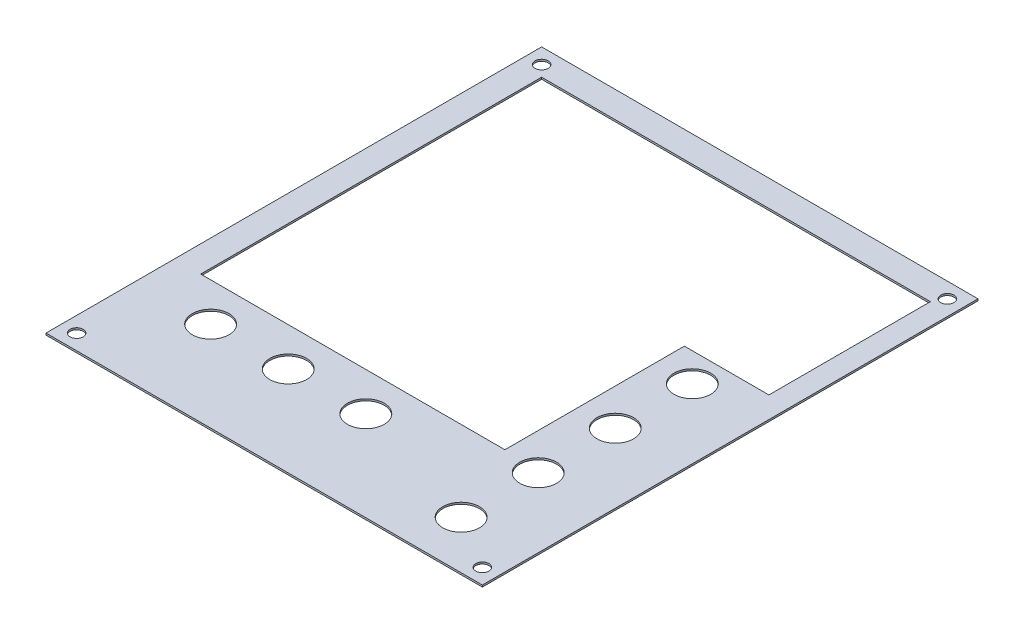
ISO-10303-21;
HEADER;
FILE_DESCRIPTION(('STEP AP214'),'2;1');
FILE_NAME('part.step','',(''),(''),'','','');
FILE_SCHEMA(('AUTOMOTIVE_DESIGN { 1 0 10303 214 1 1 1 1 }'));
ENDSEC;
DATA;
#1=APPLICATION_CONTEXT('core data for automotive mechanical design processes');
#2=APPLICATION_PROTOCOL_DEFINITION('international standard','automotive_design',2000,#1);
#3=PRODUCT_CONTEXT('',#1,'mechanical');
#4=PRODUCT('Part','Part','',(#3));
#5=PRODUCT_RELATED_PRODUCT_CATEGORY('part','',(#4));
#6=PRODUCT_DEFINITION_FORMATION('','',#4);
#7=PRODUCT_DEFINITION_CONTEXT('part definition',#1,'design');
#8=PRODUCT_DEFINITION('design','',#6,#7);
#9=PRODUCT_DEFINITION_SHAPE('','',#8);
#10=(LENGTH_UNIT() NAMED_UNIT(*) SI_UNIT(.MILLI.,.METRE.));
#11=(NAMED_UNIT(*) PLANE_ANGLE_UNIT() SI_UNIT($,.RADIAN.));
#12=(NAMED_UNIT(*) SI_UNIT($,.STERADIAN.) SOLID_ANGLE_UNIT());
#13=UNCERTAINTY_MEASURE_WITH_UNIT(LENGTH_MEASURE(1.E-05),#10,'distance_accuracy_value','');
#14=(GEOMETRIC_REPRESENTATION_CONTEXT(3) GLOBAL_UNCERTAINTY_ASSIGNED_CONTEXT((#13)) GLOBAL_UNIT_ASSIGNED_CONTEXT((#10,
#11,#12)) REPRESENTATION_CONTEXT('',''));
#15=CARTESIAN_POINT('',(0.,0.,0.));
#16=DIRECTION('',(0.,0.,1.));
#17=DIRECTION('',(1.,0.,0.));
#18=AXIS2_PLACEMENT_3D('',#15,#16,#17);
#19=CARTESIAN_POINT('',(0.,0.35,0.));
#20=DIRECTION('',(0.,1.,0.));
#21=DIRECTION('',(0.,0.,1.));
#22=AXIS2_PLACEMENT_3D('',#19,#20,#21);
#23=PLANE('',#22);
#24=CARTESIAN_POINT('',(67.047,0.35,-35.628));
#25=DIRECTION('',(0.,1.,0.));
#26=DIRECTION('',(0.,0.,1.));
#27=AXIS2_PLACEMENT_3D('',#24,#25,#26);
#28=CIRCLE('',#27,3.50000000000001);
#29=CARTESIAN_POINT('',(67.047,0.35,-32.128));
#30=VERTEX_POINT('',#29);
#31=EDGE_CURVE('E200',#30,#30,#28,.T.);
#32=ORIENTED_EDGE('',*,*,#31,.F.);
#33=EDGE_LOOP('',(#32));
#34=FACE_BOUND('',#33,.T.);
#35=CARTESIAN_POINT('',(67.047,0.35,-6.248));
#36=DIRECTION('',(0.,1.,0.));
#37=DIRECTION('',(0.,0.,1.));
#38=AXIS2_PLACEMENT_3D('',#35,#36,#37);
#39=CIRCLE('',#38,3.50000000000001);
#40=CARTESIAN_POINT('',(67.047,0.35,-2.74799999999999));
#41=VERTEX_POINT('',#40);
#42=EDGE_CURVE('E216',#41,#41,#39,.T.);
#43=ORIENTED_EDGE('',*,*,#42,.F.);
#44=EDGE_LOOP('',(#43));
#45=FACE_BOUND('',#44,.T.);
#46=CARTESIAN_POINT('',(26.095,0.35,-14.24));
#47=DIRECTION('',(0.,1.,0.));
#48=DIRECTION('',(0.,0.,1.));
#49=AXIS2_PLACEMENT_3D('',#46,#47,#48);
#50=CIRCLE('',#49,3.5);
#51=CARTESIAN_POINT('',(26.095,0.35,-10.74));
#52=VERTEX_POINT('',#51);
#53=EDGE_CURVE('E232',#52,#52,#50,.T.);
#54=ORIENTED_EDGE('',*,*,#53,.F.);
#55=EDGE_LOOP('',(#54));
#56=FACE_BOUND('',#55,.T.);
#57=CARTESIAN_POINT('',(0.,0.35,0.));
#58=DIRECTION('',(0.,1.,0.));
#59=DIRECTION('',(0.,0.,1.));
#60=AXIS2_PLACEMENT_3D('',#57,#58,#59);
#61=CIRCLE('',#60,1.25);
#62=CARTESIAN_POINT('',(0.,0.35,1.25));
#63=VERTEX_POINT('',#62);
#64=EDGE_CURVE('E248',#63,#63,#61,.T.);
#65=ORIENTED_EDGE('',*,*,#64,.F.);
#66=EDGE_LOOP('',(#65));
#67=FACE_BOUND('',#66,.T.);
#68=CARTESIAN_POINT('',(77.34,0.35,-88.64));
#69=DIRECTION('',(0.,1.,0.));
#70=DIRECTION('',(0.,0.,1.));
#71=AXIS2_PLACEMENT_3D('',#68,#69,#70);
#72=CIRCLE('',#71,1.25);
#73=CARTESIAN_POINT('',(77.34,0.35,-87.39));
#74=VERTEX_POINT('',#73);
#75=EDGE_CURVE('E264',#74,#74,#72,.T.);
#76=ORIENTED_EDGE('',*,*,#75,.F.);
#77=EDGE_LOOP('',(#76));
#78=FACE_BOUND('',#77,.T.);
#79=DIRECTION('',(0.,0.,1.));
#80=VECTOR('',#79,1.);
#81=CARTESIAN_POINT('',(-2.92000000000001,0.35,-91.56));
#82=LINE('',#81,#80);
#83=CARTESIAN_POINT('',(-2.92000000000001,0.35,-91.56));
#84=VERTEX_POINT('',#83);
#85=CARTESIAN_POINT('',(-2.92,0.35,2.92));
#86=VERTEX_POINT('',#85);
#87=EDGE_CURVE('E280',#84,#86,#82,.T.);
#88=ORIENTED_EDGE('',*,*,#87,.T.);
#89=DIRECTION('',(1.,0.,0.));
#90=VECTOR('',#89,1.);
#91=CARTESIAN_POINT('',(-2.92,0.35,2.92));
#92=LINE('',#91,#90);
#93=CARTESIAN_POINT('',(80.26,0.35,2.92));
#94=VERTEX_POINT('',#93);
#95=EDGE_CURVE('E284',#86,#94,#92,.T.);
#96=ORIENTED_EDGE('',*,*,#95,.T.);
#97=DIRECTION('',(0.,0.,-1.));
#98=VECTOR('',#97,1.);
#99=CARTESIAN_POINT('',(80.26,0.35,-91.56));
#100=LINE('',#99,#98);
#101=CARTESIAN_POINT('',(80.26,0.35,-91.56));
#102=VERTEX_POINT('',#101);
#103=EDGE_CURVE('E288',#94,#102,#100,.T.);
#104=ORIENTED_EDGE('',*,*,#103,.T.);
#105=DIRECTION('',(-1.,0.,0.));
#106=VECTOR('',#105,1.);
#107=CARTESIAN_POINT('',(-2.92000000000001,0.35,-91.56));
#108=LINE('',#107,#106);
#109=EDGE_CURVE('E291',#102,#84,#108,.T.);
#110=ORIENTED_EDGE('',*,*,#109,.T.);
#111=EDGE_LOOP('',(#88,#96,#104,#110));
#112=FACE_BOUND('',#111,.T.);
#113=CARTESIAN_POINT('',(0.,0.35,-88.64));
#114=DIRECTION('',(0.,1.,0.));
#115=DIRECTION('',(0.,0.,1.));
#116=AXIS2_PLACEMENT_3D('',#113,#114,#115);
#117=CIRCLE('',#116,1.25);
#118=CARTESIAN_POINT('',(0.,0.35,-87.39));
#119=VERTEX_POINT('',#118);
#120=EDGE_CURVE('E272',#119,#119,#117,.T.);
#121=ORIENTED_EDGE('',*,*,#120,.F.);
#122=EDGE_LOOP('',(#121));
#123=FACE_BOUND('',#122,.T.);
#124=CARTESIAN_POINT('',(77.34,0.35,0.));
#125=DIRECTION('',(0.,1.,0.));
#126=DIRECTION('',(0.,0.,1.));
#127=AXIS2_PLACEMENT_3D('',#124,#125,#126);
#128=CIRCLE('',#127,1.25);
#129=CARTESIAN_POINT('',(77.34,0.35,1.25));
#130=VERTEX_POINT('',#129);
#131=EDGE_CURVE('E256',#130,#130,#128,.T.);
#132=ORIENTED_EDGE('',*,*,#131,.F.);
#133=EDGE_LOOP('',(#132));
#134=FACE_BOUND('',#133,.T.);
#135=CARTESIAN_POINT('',(11.302,0.35,-14.24));
#136=DIRECTION('',(0.,1.,0.));
#137=DIRECTION('',(0.,0.,1.));
#138=AXIS2_PLACEMENT_3D('',#135,#136,#137);
#139=CIRCLE('',#138,3.5);
#140=CARTESIAN_POINT('',(11.302,0.35,-10.74));
#141=VERTEX_POINT('',#140);
#142=EDGE_CURVE('E240',#141,#141,#139,.T.);
#143=ORIENTED_EDGE('',*,*,#142,.F.);
#144=EDGE_LOOP('',(#143));
#145=FACE_BOUND('',#144,.T.);
#146=CARTESIAN_POINT('',(40.888,0.35,-14.24));
#147=DIRECTION('',(0.,1.,0.));
#148=DIRECTION('',(0.,0.,1.));
#149=AXIS2_PLACEMENT_3D('',#146,#147,#148);
#150=CIRCLE('',#149,3.5);
#151=CARTESIAN_POINT('',(40.888,0.35,-10.74));
#152=VERTEX_POINT('',#151);
#153=EDGE_CURVE('E224',#152,#152,#150,.T.);
#154=ORIENTED_EDGE('',*,*,#153,.F.);
#155=EDGE_LOOP('',(#154));
#156=FACE_BOUND('',#155,.T.);
#157=CARTESIAN_POINT('',(67.047,0.35,-20.938));
#158=DIRECTION('',(0.,1.,0.));
#159=DIRECTION('',(0.,0.,1.));
#160=AXIS2_PLACEMENT_3D('',#157,#158,#159);
#161=CIRCLE('',#160,3.50000000000001);
#162=CARTESIAN_POINT('',(67.047,0.35,-17.438));
#163=VERTEX_POINT('',#162);
#164=EDGE_CURVE('E208',#163,#163,#161,.T.);
#165=ORIENTED_EDGE('',*,*,#164,.F.);
#166=EDGE_LOOP('',(#165));
#167=FACE_BOUND('',#166,.T.);
#168=CARTESIAN_POINT('',(67.047,0.35,-50.318));
#169=DIRECTION('',(0.,1.,0.));
#170=DIRECTION('',(0.,0.,1.));
#171=AXIS2_PLACEMENT_3D('',#168,#169,#170);
#172=CIRCLE('',#171,3.50000000000001);
#173=CARTESIAN_POINT('',(67.047,0.35,-46.818));
#174=VERTEX_POINT('',#173);
#175=EDGE_CURVE('E192',#174,#174,#172,.T.);
#176=ORIENTED_EDGE('',*,*,#175,.F.);
#177=EDGE_LOOP('',(#176));
#178=FACE_BOUND('',#177,.T.);
#179=DIRECTION('',(1.,0.,0.));
#180=VECTOR('',#179,1.);
#181=CARTESIAN_POINT('',(2.08,0.35,-21.56));
#182=LINE('',#181,#180);
#183=CARTESIAN_POINT('',(2.08,0.35,-21.56));
#184=VERTEX_POINT('',#183);
#185=CARTESIAN_POINT('',(60.08,0.35,-21.56));
#186=VERTEX_POINT('',#185);
#187=EDGE_CURVE('E132',#184,#186,#182,.T.);
#188=ORIENTED_EDGE('',*,*,#187,.F.);
#189=DIRECTION('',(0.,0.,1.));
#190=VECTOR('',#189,1.);
#191=CARTESIAN_POINT('',(2.07999999999999,0.35,-86.56));
#192=LINE('',#191,#190);
#193=CARTESIAN_POINT('',(2.07999999999999,0.35,-86.56));
#194=VERTEX_POINT('',#193);
#195=EDGE_CURVE('E123',#194,#184,#192,.T.);
#196=ORIENTED_EDGE('',*,*,#195,.F.);
#197=DIRECTION('',(-1.,0.,0.));
#198=VECTOR('',#197,1.);
#199=CARTESIAN_POINT('',(60.08,0.35,-86.56));
#200=LINE('',#199,#198);
#201=CARTESIAN_POINT('',(76.1928571750026,0.35,-86.56));
#202=VERTEX_POINT('',#201);
#203=EDGE_CURVE('E158',#202,#194,#200,.T.);
#204=ORIENTED_EDGE('',*,*,#203,.F.);
#205=DIRECTION('',(0.,0.,-1.));
#206=VECTOR('',#205,1.);
#207=CARTESIAN_POINT('',(76.1928571750026,0.35,-86.56));
#208=LINE('',#207,#206);
#209=CARTESIAN_POINT('',(76.1928571750026,0.35,-55.768));
#210=VERTEX_POINT('',#209);
#211=EDGE_CURVE('E155',#210,#202,#208,.T.);
#212=ORIENTED_EDGE('',*,*,#211,.F.);
#213=DIRECTION('',(1.,0.,0.));
#214=VECTOR('',#213,1.);
#215=CARTESIAN_POINT('',(60.08,0.35,-55.768));
#216=LINE('',#215,#214);
#217=CARTESIAN_POINT('',(60.08,0.35,-55.768));
#218=VERTEX_POINT('',#217);
#219=EDGE_CURVE('E150',#218,#210,#216,.T.);
#220=ORIENTED_EDGE('',*,*,#219,.F.);
#221=DIRECTION('',(0.,0.,-1.));
#222=VECTOR('',#221,1.);
#223=CARTESIAN_POINT('',(60.08,0.35,-55.768));
#224=LINE('',#223,#222);
#225=EDGE_CURVE('E146',#186,#218,#224,.T.);
#226=ORIENTED_EDGE('',*,*,#225,.F.);
#227=EDGE_LOOP('',(#188,#196,#204,#212,#220,#226));
#228=FACE_BOUND('',#227,.T.);
#229=ADVANCED_FACE('F45',(#34,#45,#56,#67,#78,#112,#123,#134,#145,#156,#167,#178,#228),#23,.T.);
#230=CARTESIAN_POINT('',(0.,0.,0.));
#231=DIRECTION('',(0.,1.,0.));
#232=DIRECTION('',(0.,0.,1.));
#233=AXIS2_PLACEMENT_3D('',#230,#231,#232);
#234=PLANE('',#233);
#235=CARTESIAN_POINT('',(67.047,0.,-50.318));
#236=DIRECTION('',(0.,1.,0.));
#237=DIRECTION('',(0.,0.,1.));
#238=AXIS2_PLACEMENT_3D('',#235,#236,#237);
#239=CIRCLE('',#238,3.50000000000001);
#240=CARTESIAN_POINT('',(67.047,0.,-46.818));
#241=VERTEX_POINT('',#240);
#242=EDGE_CURVE('E141',#241,#241,#239,.T.);
#243=ORIENTED_EDGE('',*,*,#242,.T.);
#244=EDGE_LOOP('',(#243));
#245=FACE_BOUND('',#244,.T.);
#246=CARTESIAN_POINT('',(67.047,0.,-35.628));
#247=DIRECTION('',(0.,1.,0.));
#248=DIRECTION('',(0.,0.,1.));
#249=AXIS2_PLACEMENT_3D('',#246,#247,#248);
#250=CIRCLE('',#249,3.50000000000001);
#251=CARTESIAN_POINT('',(67.047,0.,-32.128));
#252=VERTEX_POINT('',#251);
#253=EDGE_CURVE('E196',#252,#252,#250,.T.);
#254=ORIENTED_EDGE('',*,*,#253,.T.);
#255=EDGE_LOOP('',(#254));
#256=FACE_BOUND('',#255,.T.);
#257=CARTESIAN_POINT('',(67.047,0.,-20.938));
#258=DIRECTION('',(0.,1.,0.));
#259=DIRECTION('',(0.,0.,1.));
#260=AXIS2_PLACEMENT_3D('',#257,#258,#259);
#261=CIRCLE('',#260,3.50000000000001);
#262=CARTESIAN_POINT('',(67.047,0.,-17.438));
#263=VERTEX_POINT('',#262);
#264=EDGE_CURVE('E204',#263,#263,#261,.T.);
#265=ORIENTED_EDGE('',*,*,#264,.T.);
#266=EDGE_LOOP('',(#265));
#267=FACE_BOUND('',#266,.T.);
#268=CARTESIAN_POINT('',(67.047,0.,-6.248));
#269=DIRECTION('',(0.,1.,0.));
#270=DIRECTION('',(0.,0.,1.));
#271=AXIS2_PLACEMENT_3D('',#268,#269,#270);
#272=CIRCLE('',#271,3.50000000000001);
#273=CARTESIAN_POINT('',(67.047,0.,-2.74799999999999));
#274=VERTEX_POINT('',#273);
#275=EDGE_CURVE('E212',#274,#274,#272,.T.);
#276=ORIENTED_EDGE('',*,*,#275,.T.);
#277=EDGE_LOOP('',(#276));
#278=FACE_BOUND('',#277,.T.);
#279=CARTESIAN_POINT('',(40.888,0.,-14.24));
#280=DIRECTION('',(0.,1.,0.));
#281=DIRECTION('',(0.,0.,1.));
#282=AXIS2_PLACEMENT_3D('',#279,#280,#281);
#283=CIRCLE('',#282,3.5);
#284=CARTESIAN_POINT('',(40.888,0.,-10.74));
#285=VERTEX_POINT('',#284);
#286=EDGE_CURVE('E220',#285,#285,#283,.T.);
#287=ORIENTED_EDGE('',*,*,#286,.T.);
#288=EDGE_LOOP('',(#287));
#289=FACE_BOUND('',#288,.T.);
#290=CARTESIAN_POINT('',(26.095,0.,-14.24));
#291=DIRECTION('',(0.,1.,0.));
#292=DIRECTION('',(0.,0.,1.));
#293=AXIS2_PLACEMENT_3D('',#290,#291,#292);
#294=CIRCLE('',#293,3.5);
#295=CARTESIAN_POINT('',(26.095,0.,-10.74));
#296=VERTEX_POINT('',#295);
#297=EDGE_CURVE('E228',#296,#296,#294,.T.);
#298=ORIENTED_EDGE('',*,*,#297,.T.);
#299=EDGE_LOOP('',(#298));
#300=FACE_BOUND('',#299,.T.);
#301=CARTESIAN_POINT('',(11.302,0.,-14.24));
#302=DIRECTION('',(0.,1.,0.));
#303=DIRECTION('',(0.,0.,1.));
#304=AXIS2_PLACEMENT_3D('',#301,#302,#303);
#305=CIRCLE('',#304,3.5);
#306=CARTESIAN_POINT('',(11.302,0.,-10.74));
#307=VERTEX_POINT('',#306);
#308=EDGE_CURVE('E236',#307,#307,#305,.T.);
#309=ORIENTED_EDGE('',*,*,#308,.T.);
#310=EDGE_LOOP('',(#309));
#311=FACE_BOUND('',#310,.T.);
#312=CARTESIAN_POINT('',(0.,0.,0.));
#313=DIRECTION('',(0.,1.,0.));
#314=DIRECTION('',(0.,0.,1.));
#315=AXIS2_PLACEMENT_3D('',#312,#313,#314);
#316=CIRCLE('',#315,1.25);
#317=CARTESIAN_POINT('',(0.,0.,1.25));
#318=VERTEX_POINT('',#317);
#319=EDGE_CURVE('E244',#318,#318,#316,.T.);
#320=ORIENTED_EDGE('',*,*,#319,.T.);
#321=EDGE_LOOP('',(#320));
#322=FACE_BOUND('',#321,.T.);
#323=CARTESIAN_POINT('',(77.34,0.,0.));
#324=DIRECTION('',(0.,1.,0.));
#325=DIRECTION('',(0.,0.,1.));
#326=AXIS2_PLACEMENT_3D('',#323,#324,#325);
#327=CIRCLE('',#326,1.25);
#328=CARTESIAN_POINT('',(77.34,0.,1.25));
#329=VERTEX_POINT('',#328);
#330=EDGE_CURVE('E252',#329,#329,#327,.T.);
#331=ORIENTED_EDGE('',*,*,#330,.T.);
#332=EDGE_LOOP('',(#331));
#333=FACE_BOUND('',#332,.T.);
#334=CARTESIAN_POINT('',(77.34,0.,-88.64));
#335=DIRECTION('',(0.,1.,0.));
#336=DIRECTION('',(0.,0.,1.));
#337=AXIS2_PLACEMENT_3D('',#334,#335,#336);
#338=CIRCLE('',#337,1.25);
#339=CARTESIAN_POINT('',(77.34,0.,-87.39));
#340=VERTEX_POINT('',#339);
#341=EDGE_CURVE('E260',#340,#340,#338,.T.);
#342=ORIENTED_EDGE('',*,*,#341,.T.);
#343=EDGE_LOOP('',(#342));
#344=FACE_BOUND('',#343,.T.);
#345=CARTESIAN_POINT('',(0.,0.,-88.64));
#346=DIRECTION('',(0.,1.,0.));
#347=DIRECTION('',(0.,0.,1.));
#348=AXIS2_PLACEMENT_3D('',#345,#346,#347);
#349=CIRCLE('',#348,1.25);
#350=CARTESIAN_POINT('',(0.,0.,-87.39));
#351=VERTEX_POINT('',#350);
#352=EDGE_CURVE('E268',#351,#351,#349,.T.);
#353=ORIENTED_EDGE('',*,*,#352,.T.);
#354=EDGE_LOOP('',(#353));
#355=FACE_BOUND('',#354,.T.);
#356=DIRECTION('',(0.,0.,1.));
#357=VECTOR('',#356,1.);
#358=CARTESIAN_POINT('',(-2.92000000000001,0.,-91.56));
#359=LINE('',#358,#357);
#360=CARTESIAN_POINT('',(-2.92000000000001,0.,-91.56));
#361=VERTEX_POINT('',#360);
#362=CARTESIAN_POINT('',(-2.92,0.,2.92));
#363=VERTEX_POINT('',#362);
#364=EDGE_CURVE('E276',#361,#363,#359,.T.);
#365=ORIENTED_EDGE('',*,*,#364,.F.);
#366=DIRECTION('',(-1.,0.,0.));
#367=VECTOR('',#366,1.);
#368=CARTESIAN_POINT('',(-2.92000000000001,0.,-91.56));
#369=LINE('',#368,#367);
#370=CARTESIAN_POINT('',(80.26,0.,-91.56));
#371=VERTEX_POINT('',#370);
#372=EDGE_CURVE('E285',#371,#361,#369,.T.);
#373=ORIENTED_EDGE('',*,*,#372,.F.);
#374=DIRECTION('',(0.,0.,-1.));
#375=VECTOR('',#374,1.);
#376=CARTESIAN_POINT('',(80.26,0.,-91.56));
#377=LINE('',#376,#375);
#378=CARTESIAN_POINT('',(80.26,0.,2.92));
#379=VERTEX_POINT('',#378);
#380=EDGE_CURVE('E301',#379,#371,#377,.T.);
#381=ORIENTED_EDGE('',*,*,#380,.F.);
#382=DIRECTION('',(1.,0.,0.));
#383=VECTOR('',#382,1.);
#384=CARTESIAN_POINT('',(-2.92,0.,2.92));
#385=LINE('',#384,#383);
#386=EDGE_CURVE('E298',#363,#379,#385,.T.);
#387=ORIENTED_EDGE('',*,*,#386,.F.);
#388=EDGE_LOOP('',(#365,#373,#381,#387));
#389=FACE_BOUND('',#388,.T.);
#390=DIRECTION('',(0.,0.,1.));
#391=VECTOR('',#390,1.);
#392=CARTESIAN_POINT('',(2.07999999999999,0.,-86.56));
#393=LINE('',#392,#391);
#394=CARTESIAN_POINT('',(2.07999999999999,0.,-86.56));
#395=VERTEX_POINT('',#394);
#396=CARTESIAN_POINT('',(2.08,0.,-21.56));
#397=VERTEX_POINT('',#396);
#398=EDGE_CURVE('E69',#395,#397,#393,.T.);
#399=ORIENTED_EDGE('',*,*,#398,.T.);
#400=DIRECTION('',(1.,0.,0.));
#401=VECTOR('',#400,1.);
#402=CARTESIAN_POINT('',(2.08,0.,-21.56));
#403=LINE('',#402,#401);
#404=CARTESIAN_POINT('',(60.08,0.,-21.56));
#405=VERTEX_POINT('',#404);
#406=EDGE_CURVE('E139',#397,#405,#403,.T.);
#407=ORIENTED_EDGE('',*,*,#406,.T.);
#408=DIRECTION('',(0.,0.,-1.));
#409=VECTOR('',#408,1.);
#410=CARTESIAN_POINT('',(60.08,0.,-55.768));
#411=LINE('',#410,#409);
#412=CARTESIAN_POINT('',(60.08,0.,-55.768));
#413=VERTEX_POINT('',#412);
#414=EDGE_CURVE('E165',#405,#413,#411,.T.);
#415=ORIENTED_EDGE('',*,*,#414,.T.);
#416=DIRECTION('',(1.,0.,0.));
#417=VECTOR('',#416,1.);
#418=CARTESIAN_POINT('',(60.08,0.,-55.768));
#419=LINE('',#418,#417);
#420=CARTESIAN_POINT('',(76.1928571750026,0.,-55.768));
#421=VERTEX_POINT('',#420);
#422=EDGE_CURVE('E169',#413,#421,#419,.T.);
#423=ORIENTED_EDGE('',*,*,#422,.T.);
#424=DIRECTION('',(0.,0.,-1.));
#425=VECTOR('',#424,1.);
#426=CARTESIAN_POINT('',(76.1928571750026,0.,-86.56));
#427=LINE('',#426,#425);
#428=CARTESIAN_POINT('',(76.1928571750026,0.,-86.56));
#429=VERTEX_POINT('',#428);
#430=EDGE_CURVE('E173',#421,#429,#427,.T.);
#431=ORIENTED_EDGE('',*,*,#430,.T.);
#432=DIRECTION('',(-1.,0.,0.));
#433=VECTOR('',#432,1.);
#434=CARTESIAN_POINT('',(2.07999999999999,0.,-86.56));
#435=LINE('',#434,#433);
#436=EDGE_CURVE('E133',#429,#395,#435,.T.);
#437=ORIENTED_EDGE('',*,*,#436,.T.);
#438=EDGE_LOOP('',(#399,#407,#415,#423,#431,#437));
#439=FACE_BOUND('',#438,.T.);
#440=ADVANCED_FACE('F324',(#245,#256,#267,#278,#289,#300,#311,#322,#333,#344,#355,#389,#439),
#234,.F.);
#441=CARTESIAN_POINT('',(-2.92000000000001,0.35,-91.56));
#442=DIRECTION('',(1.,0.,0.));
#443=DIRECTION('',(0.,0.,-1.));
#444=AXIS2_PLACEMENT_3D('',#441,#442,#443);
#445=PLANE('',#444);
#446=ORIENTED_EDGE('',*,*,#364,.T.);
#447=DIRECTION('',(0.,-1.,0.));
#448=VECTOR('',#447,1.);
#449=CARTESIAN_POINT('',(-2.92,0.35,2.92));
#450=LINE('',#449,#448);
#451=EDGE_CURVE('E11',#86,#363,#450,.T.);
#452=ORIENTED_EDGE('',*,*,#451,.F.);
#453=ORIENTED_EDGE('',*,*,#87,.F.);
#454=DIRECTION('',(0.,-1.,0.));
#455=VECTOR('',#454,1.);
#456=CARTESIAN_POINT('',(-2.92000000000001,0.35,-91.56));
#457=LINE('',#456,#455);
#458=EDGE_CURVE('E294',#84,#361,#457,.T.);
#459=ORIENTED_EDGE('',*,*,#458,.T.);
#460=EDGE_LOOP('',(#446,#452,#453,#459));
#461=FACE_BOUND('',#460,.T.);
#462=ADVANCED_FACE('F47',(#461),#445,.F.);
#463=CARTESIAN_POINT('',(-2.92,0.35,2.92));
#464=DIRECTION('',(0.,0.,-1.));
#465=DIRECTION('',(-1.,0.,0.));
#466=AXIS2_PLACEMENT_3D('',#463,#464,#465);
#467=PLANE('',#466);
#468=ORIENTED_EDGE('',*,*,#386,.T.);
#469=DIRECTION('',(0.,-1.,0.));
#470=VECTOR('',#469,1.);
#471=CARTESIAN_POINT('',(80.26,0.35,2.92));
#472=LINE('',#471,#470);
#473=EDGE_CURVE('E54',#94,#379,#472,.T.);
#474=ORIENTED_EDGE('',*,*,#473,.F.);
#475=ORIENTED_EDGE('',*,*,#95,.F.);
#476=ORIENTED_EDGE('',*,*,#451,.T.);
#477=EDGE_LOOP('',(#468,#474,#475,#476));
#478=FACE_BOUND('',#477,.T.);
#479=ADVANCED_FACE('F335',(#478),#467,.F.);
#480=CARTESIAN_POINT('',(80.26,0.35,-91.56));
#481=DIRECTION('',(-1.,0.,0.));
#482=DIRECTION('',(0.,0.,1.));
#483=AXIS2_PLACEMENT_3D('',#480,#481,#482);
#484=PLANE('',#483);
#485=ORIENTED_EDGE('',*,*,#380,.T.);
#486=DIRECTION('',(0.,-1.,0.));
#487=VECTOR('',#486,1.);
#488=CARTESIAN_POINT('',(80.26,0.35,-91.56));
#489=LINE('',#488,#487);
#490=EDGE_CURVE('E309',#102,#371,#489,.T.);
#491=ORIENTED_EDGE('',*,*,#490,.F.);
#492=ORIENTED_EDGE('',*,*,#103,.F.);
#493=ORIENTED_EDGE('',*,*,#473,.T.);
#494=EDGE_LOOP('',(#485,#491,#492,#493));
#495=FACE_BOUND('',#494,.T.);
#496=ADVANCED_FACE('F318',(#495),#484,.F.);
#497=CARTESIAN_POINT('',(-2.92000000000001,0.35,-91.56));
#498=DIRECTION('',(0.,0.,1.));
#499=DIRECTION('',(1.,0.,0.));
#500=AXIS2_PLACEMENT_3D('',#497,#498,#499);
#501=PLANE('',#500);
#502=ORIENTED_EDGE('',*,*,#372,.T.);
#503=ORIENTED_EDGE('',*,*,#458,.F.);
#504=ORIENTED_EDGE('',*,*,#109,.F.);
#505=ORIENTED_EDGE('',*,*,#490,.T.);
#506=EDGE_LOOP('',(#502,#503,#504,#505));
#507=FACE_BOUND('',#506,.T.);
#508=ADVANCED_FACE('F328',(#507),#501,.F.);
#509=CARTESIAN_POINT('',(0.,0.35,-88.64));
#510=DIRECTION('',(0.,-1.,0.));
#511=DIRECTION('',(0.,0.,-1.));
#512=AXIS2_PLACEMENT_3D('',#509,#510,#511);
#513=CYLINDRICAL_SURFACE('',#512,1.25);
#514=ORIENTED_EDGE('',*,*,#120,.T.);
#515=EDGE_LOOP('',(#514));
#516=FACE_BOUND('',#515,.T.);
#517=ORIENTED_EDGE('',*,*,#352,.F.);
#518=EDGE_LOOP('',(#517));
#519=FACE_BOUND('',#518,.T.);
#520=ADVANCED_FACE('F353',(#516,#519),#513,.F.);
#521=CARTESIAN_POINT('',(77.34,0.35,-88.64));
#522=DIRECTION('',(0.,-1.,0.));
#523=DIRECTION('',(0.,0.,-1.));
#524=AXIS2_PLACEMENT_3D('',#521,#522,#523);
#525=CYLINDRICAL_SURFACE('',#524,1.25);
#526=ORIENTED_EDGE('',*,*,#75,.T.);
#527=EDGE_LOOP('',(#526));
#528=FACE_BOUND('',#527,.T.);
#529=ORIENTED_EDGE('',*,*,#341,.F.);
#530=EDGE_LOOP('',(#529));
#531=FACE_BOUND('',#530,.T.);
#532=ADVANCED_FACE('F360',(#528,#531),#525,.F.);
#533=CARTESIAN_POINT('',(77.34,0.35,0.));
#534=DIRECTION('',(0.,-1.,0.));
#535=DIRECTION('',(0.,0.,-1.));
#536=AXIS2_PLACEMENT_3D('',#533,#534,#535);
#537=CYLINDRICAL_SURFACE('',#536,1.25);
#538=ORIENTED_EDGE('',*,*,#131,.T.);
#539=EDGE_LOOP('',(#538));
#540=FACE_BOUND('',#539,.T.);
#541=ORIENTED_EDGE('',*,*,#330,.F.);
#542=EDGE_LOOP('',(#541));
#543=FACE_BOUND('',#542,.T.);
#544=ADVANCED_FACE('F365',(#540,#543),#537,.F.);
#545=CARTESIAN_POINT('',(0.,0.35,0.));
#546=DIRECTION('',(0.,-1.,0.));
#547=DIRECTION('',(0.,0.,-1.));
#548=AXIS2_PLACEMENT_3D('',#545,#546,#547);
#549=CYLINDRICAL_SURFACE('',#548,1.25);
#550=ORIENTED_EDGE('',*,*,#64,.T.);
#551=EDGE_LOOP('',(#550));
#552=FACE_BOUND('',#551,.T.);
#553=ORIENTED_EDGE('',*,*,#319,.F.);
#554=EDGE_LOOP('',(#553));
#555=FACE_BOUND('',#554,.T.);
#556=ADVANCED_FACE('F409',(#552,#555),#549,.F.);
#557=CARTESIAN_POINT('',(11.302,0.35,-14.24));
#558=DIRECTION('',(0.,-1.,0.));
#559=DIRECTION('',(0.,0.,-1.));
#560=AXIS2_PLACEMENT_3D('',#557,#558,#559);
#561=CYLINDRICAL_SURFACE('',#560,3.5);
#562=ORIENTED_EDGE('',*,*,#142,.T.);
#563=EDGE_LOOP('',(#562));
#564=FACE_BOUND('',#563,.T.);
#565=ORIENTED_EDGE('',*,*,#308,.F.);
#566=EDGE_LOOP('',(#565));
#567=FACE_BOUND('',#566,.T.);
#568=ADVANCED_FACE('F415',(#564,#567),#561,.F.);
#569=CARTESIAN_POINT('',(26.095,0.35,-14.24));
#570=DIRECTION('',(0.,-1.,0.));
#571=DIRECTION('',(0.,0.,-1.));
#572=AXIS2_PLACEMENT_3D('',#569,#570,#571);
#573=CYLINDRICAL_SURFACE('',#572,3.5);
#574=ORIENTED_EDGE('',*,*,#53,.T.);
#575=EDGE_LOOP('',(#574));
#576=FACE_BOUND('',#575,.T.);
#577=ORIENTED_EDGE('',*,*,#297,.F.);
#578=EDGE_LOOP('',(#577));
#579=FACE_BOUND('',#578,.T.);
#580=ADVANCED_FACE('F421',(#576,#579),#573,.F.);
#581=CARTESIAN_POINT('',(40.888,0.35,-14.24));
#582=DIRECTION('',(0.,-1.,0.));
#583=DIRECTION('',(0.,0.,-1.));
#584=AXIS2_PLACEMENT_3D('',#581,#582,#583);
#585=CYLINDRICAL_SURFACE('',#584,3.5);
#586=ORIENTED_EDGE('',*,*,#153,.T.);
#587=EDGE_LOOP('',(#586));
#588=FACE_BOUND('',#587,.T.);
#589=ORIENTED_EDGE('',*,*,#286,.F.);
#590=EDGE_LOOP('',(#589));
#591=FACE_BOUND('',#590,.T.);
#592=ADVANCED_FACE('F425',(#588,#591),#585,.F.);
#593=CARTESIAN_POINT('',(67.047,0.35,-6.248));
#594=DIRECTION('',(0.,-1.,0.));
#595=DIRECTION('',(0.,0.,-1.));
#596=AXIS2_PLACEMENT_3D('',#593,#594,#595);
#597=CYLINDRICAL_SURFACE('',#596,3.50000000000001);
#598=ORIENTED_EDGE('',*,*,#42,.T.);
#599=EDGE_LOOP('',(#598));
#600=FACE_BOUND('',#599,.T.);
#601=ORIENTED_EDGE('',*,*,#275,.F.);
#602=EDGE_LOOP('',(#601));
#603=FACE_BOUND('',#602,.T.);
#604=ADVANCED_FACE('F429',(#600,#603),#597,.F.);
#605=CARTESIAN_POINT('',(67.047,0.35,-20.938));
#606=DIRECTION('',(0.,-1.,0.));
#607=DIRECTION('',(0.,0.,-1.));
#608=AXIS2_PLACEMENT_3D('',#605,#606,#607);
#609=CYLINDRICAL_SURFACE('',#608,3.50000000000001);
#610=ORIENTED_EDGE('',*,*,#164,.T.);
#611=EDGE_LOOP('',(#610));
#612=FACE_BOUND('',#611,.T.);
#613=ORIENTED_EDGE('',*,*,#264,.F.);
#614=EDGE_LOOP('',(#613));
#615=FACE_BOUND('',#614,.T.);
#616=ADVANCED_FACE('F433',(#612,#615),#609,.F.);
#617=CARTESIAN_POINT('',(67.047,0.35,-35.628));
#618=DIRECTION('',(0.,-1.,0.));
#619=DIRECTION('',(0.,0.,-1.));
#620=AXIS2_PLACEMENT_3D('',#617,#618,#619);
#621=CYLINDRICAL_SURFACE('',#620,3.50000000000001);
#622=ORIENTED_EDGE('',*,*,#31,.T.);
#623=EDGE_LOOP('',(#622));
#624=FACE_BOUND('',#623,.T.);
#625=ORIENTED_EDGE('',*,*,#253,.F.);
#626=EDGE_LOOP('',(#625));
#627=FACE_BOUND('',#626,.T.);
#628=ADVANCED_FACE('F385',(#624,#627),#621,.F.);
#629=CARTESIAN_POINT('',(67.047,0.35,-50.318));
#630=DIRECTION('',(0.,-1.,0.));
#631=DIRECTION('',(0.,0.,-1.));
#632=AXIS2_PLACEMENT_3D('',#629,#630,#631);
#633=CYLINDRICAL_SURFACE('',#632,3.50000000000001);
#634=ORIENTED_EDGE('',*,*,#175,.T.);
#635=EDGE_LOOP('',(#634));
#636=FACE_BOUND('',#635,.T.);
#637=ORIENTED_EDGE('',*,*,#242,.F.);
#638=EDGE_LOOP('',(#637));
#639=FACE_BOUND('',#638,.T.);
#640=ADVANCED_FACE('F382',(#636,#639),#633,.F.);
#641=CARTESIAN_POINT('',(2.07999999999999,0.35,-86.56));
#642=DIRECTION('',(1.,0.,0.));
#643=DIRECTION('',(0.,0.,-1.));
#644=AXIS2_PLACEMENT_3D('',#641,#642,#643);
#645=PLANE('',#644);
#646=ORIENTED_EDGE('',*,*,#398,.F.);
#647=DIRECTION('',(0.,-1.,0.));
#648=VECTOR('',#647,1.);
#649=CARTESIAN_POINT('',(2.07999999999999,0.35,-86.56));
#650=LINE('',#649,#648);
#651=EDGE_CURVE('E127',#194,#395,#650,.T.);
#652=ORIENTED_EDGE('',*,*,#651,.F.);
#653=ORIENTED_EDGE('',*,*,#195,.T.);
#654=DIRECTION('',(0.,-1.,0.));
#655=VECTOR('',#654,1.);
#656=CARTESIAN_POINT('',(2.08,0.35,-21.56));
#657=LINE('',#656,#655);
#658=EDGE_CURVE('E126',#184,#397,#657,.T.);
#659=ORIENTED_EDGE('',*,*,#658,.T.);
#660=EDGE_LOOP('',(#646,#652,#653,#659));
#661=FACE_BOUND('',#660,.T.);
#662=ADVANCED_FACE('F125',(#661),#645,.T.);
#663=CARTESIAN_POINT('',(2.08,0.35,-21.56));
#664=DIRECTION('',(0.,0.,-1.));
#665=DIRECTION('',(-1.,0.,0.));
#666=AXIS2_PLACEMENT_3D('',#663,#664,#665);
#667=PLANE('',#666);
#668=ORIENTED_EDGE('',*,*,#406,.F.);
#669=ORIENTED_EDGE('',*,*,#658,.F.);
#670=ORIENTED_EDGE('',*,*,#187,.T.);
#671=DIRECTION('',(0.,-1.,0.));
#672=VECTOR('',#671,1.);
#673=CARTESIAN_POINT('',(60.08,0.35,-21.56));
#674=LINE('',#673,#672);
#675=EDGE_CURVE('E142',#186,#405,#674,.T.);
#676=ORIENTED_EDGE('',*,*,#675,.T.);
#677=EDGE_LOOP('',(#668,#669,#670,#676));
#678=FACE_BOUND('',#677,.T.);
#679=ADVANCED_FACE('F136',(#678),#667,.T.);
#680=CARTESIAN_POINT('',(60.08,0.35,-55.768));
#681=DIRECTION('',(-1.,0.,0.));
#682=DIRECTION('',(0.,0.,1.));
#683=AXIS2_PLACEMENT_3D('',#680,#681,#682);
#684=PLANE('',#683);
#685=ORIENTED_EDGE('',*,*,#414,.F.);
#686=ORIENTED_EDGE('',*,*,#675,.F.);
#687=ORIENTED_EDGE('',*,*,#225,.T.);
#688=DIRECTION('',(0.,-1.,0.));
#689=VECTOR('',#688,1.);
#690=CARTESIAN_POINT('',(60.08,0.35,-55.768));
#691=LINE('',#690,#689);
#692=EDGE_CURVE('E187',#218,#413,#691,.T.);
#693=ORIENTED_EDGE('',*,*,#692,.T.);
#694=EDGE_LOOP('',(#685,#686,#687,#693));
#695=FACE_BOUND('',#694,.T.);
#696=ADVANCED_FACE('F445',(#695),#684,.T.);
#697=CARTESIAN_POINT('',(60.08,0.35,-55.768));
#698=DIRECTION('',(0.,0.,-1.));
#699=DIRECTION('',(-1.,0.,0.));
#700=AXIS2_PLACEMENT_3D('',#697,#698,#699);
#701=PLANE('',#700);
#702=ORIENTED_EDGE('',*,*,#422,.F.);
#703=ORIENTED_EDGE('',*,*,#692,.F.);
#704=ORIENTED_EDGE('',*,*,#219,.T.);
#705=DIRECTION('',(0.,-1.,0.));
#706=VECTOR('',#705,1.);
#707=CARTESIAN_POINT('',(76.1928571750026,0.35,-55.768));
#708=LINE('',#707,#706);
#709=EDGE_CURVE('E184',#210,#421,#708,.T.);
#710=ORIENTED_EDGE('',*,*,#709,.T.);
#711=EDGE_LOOP('',(#702,#703,#704,#710));
#712=FACE_BOUND('',#711,.T.);
#713=ADVANCED_FACE('F448',(#712),#701,.T.);
#714=CARTESIAN_POINT('',(76.1928571750026,0.35,-86.56));
#715=DIRECTION('',(-1.,0.,0.));
#716=DIRECTION('',(0.,0.,1.));
#717=AXIS2_PLACEMENT_3D('',#714,#715,#716);
#718=PLANE('',#717);
#719=ORIENTED_EDGE('',*,*,#430,.F.);
#720=ORIENTED_EDGE('',*,*,#709,.F.);
#721=ORIENTED_EDGE('',*,*,#211,.T.);
#722=DIRECTION('',(0.,-1.,0.));
#723=VECTOR('',#722,1.);
#724=CARTESIAN_POINT('',(76.1928571750026,0.35,-86.56));
#725=LINE('',#724,#723);
#726=EDGE_CURVE('E61',#202,#429,#725,.T.);
#727=ORIENTED_EDGE('',*,*,#726,.T.);
#728=EDGE_LOOP('',(#719,#720,#721,#727));
#729=FACE_BOUND('',#728,.T.);
#730=ADVANCED_FACE('F452',(#729),#718,.T.);
#731=CARTESIAN_POINT('',(2.07999999999999,0.35,-86.56));
#732=DIRECTION('',(0.,0.,1.));
#733=DIRECTION('',(1.,0.,0.));
#734=AXIS2_PLACEMENT_3D('',#731,#732,#733);
#735=PLANE('',#734);
#736=ORIENTED_EDGE('',*,*,#436,.F.);
#737=ORIENTED_EDGE('',*,*,#726,.F.);
#738=ORIENTED_EDGE('',*,*,#203,.T.);
#739=ORIENTED_EDGE('',*,*,#651,.T.);
#740=EDGE_LOOP('',(#736,#737,#738,#739));
#741=FACE_BOUND('',#740,.T.);
#742=ADVANCED_FACE('F456',(#741),#735,.T.);
#743=CLOSED_SHELL('',(#229,#440,#462,#479,#496,#508,#520,#532,#544,#556,#568,#580,#592,#604,
#616,#628,#640,#662,#679,#696,#713,#730,#742));
#744=MANIFOLD_SOLID_BREP('B2',#743);
#745=ADVANCED_BREP_SHAPE_REPRESENTATION('',(#18,#744),#14);
#746=SHAPE_DEFINITION_REPRESENTATION(#9,#745);
ENDSEC;
END-ISO-10303-21;
